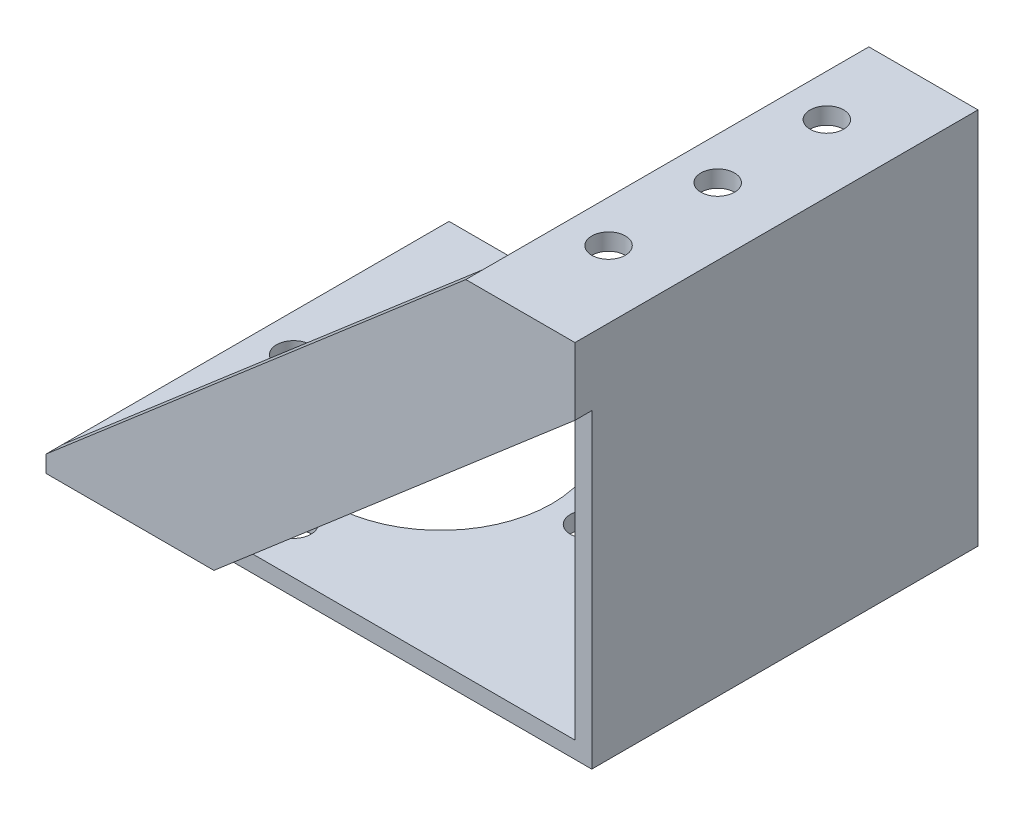
ISO-10303-21;
HEADER;
FILE_DESCRIPTION(('STEP AP214'),'2;1');
FILE_NAME('part.step','',(''),(''),'','','');
FILE_SCHEMA(('AUTOMOTIVE_DESIGN { 1 0 10303 214 1 1 1 1 }'));
ENDSEC;
DATA;
#1=APPLICATION_CONTEXT('core data for automotive mechanical design processes');
#2=APPLICATION_PROTOCOL_DEFINITION('international standard','automotive_design',2000,#1);
#3=PRODUCT_CONTEXT('',#1,'mechanical');
#4=PRODUCT('Part','Part','',(#3));
#5=PRODUCT_RELATED_PRODUCT_CATEGORY('part','',(#4));
#6=PRODUCT_DEFINITION_FORMATION('','',#4);
#7=PRODUCT_DEFINITION_CONTEXT('part definition',#1,'design');
#8=PRODUCT_DEFINITION('design','',#6,#7);
#9=PRODUCT_DEFINITION_SHAPE('','',#8);
#10=(LENGTH_UNIT() NAMED_UNIT(*) SI_UNIT(.MILLI.,.METRE.));
#11=(NAMED_UNIT(*) PLANE_ANGLE_UNIT() SI_UNIT($,.RADIAN.));
#12=(NAMED_UNIT(*) SI_UNIT($,.STERADIAN.) SOLID_ANGLE_UNIT());
#13=UNCERTAINTY_MEASURE_WITH_UNIT(LENGTH_MEASURE(1.E-05),#10,'distance_accuracy_value','');
#14=(GEOMETRIC_REPRESENTATION_CONTEXT(3) GLOBAL_UNCERTAINTY_ASSIGNED_CONTEXT((#13)) GLOBAL_UNIT_ASSIGNED_CONTEXT((#10,
#11,#12)) REPRESENTATION_CONTEXT('',''));
#15=CARTESIAN_POINT('',(0.,0.,0.));
#16=DIRECTION('',(0.,0.,1.));
#17=DIRECTION('',(1.,0.,0.));
#18=AXIS2_PLACEMENT_3D('',#15,#16,#17);
#19=CARTESIAN_POINT('',(-63.,0.,46.));
#20=DIRECTION('',(0.,1.,0.));
#21=DIRECTION('',(0.,0.,1.));
#22=AXIS2_PLACEMENT_3D('',#19,#20,#21);
#23=PLANE('',#22);
#24=CARTESIAN_POINT('',(-8.,0.,10.));
#25=DIRECTION('',(0.,1.,0.));
#26=DIRECTION('',(0.,0.,1.));
#27=AXIS2_PLACEMENT_3D('',#24,#25,#26);
#28=CIRCLE('',#27,2.);
#29=CARTESIAN_POINT('',(-8.,0.,12.));
#30=VERTEX_POINT('',#29);
#31=EDGE_CURVE('E201',#30,#30,#28,.T.);
#32=ORIENTED_EDGE('',*,*,#31,.T.);
#33=EDGE_LOOP('',(#32));
#34=FACE_BOUND('',#33,.T.);
#35=CARTESIAN_POINT('',(-8.,0.,23.));
#36=DIRECTION('',(0.,1.,0.));
#37=DIRECTION('',(0.,0.,1.));
#38=AXIS2_PLACEMENT_3D('',#35,#36,#37);
#39=CIRCLE('',#38,2.);
#40=CARTESIAN_POINT('',(-8.,0.,25.));
#41=VERTEX_POINT('',#40);
#42=EDGE_CURVE('E195',#41,#41,#39,.T.);
#43=ORIENTED_EDGE('',*,*,#42,.T.);
#44=EDGE_LOOP('',(#43));
#45=FACE_BOUND('',#44,.T.);
#46=CARTESIAN_POINT('',(-8.,0.,36.));
#47=DIRECTION('',(0.,1.,0.));
#48=DIRECTION('',(0.,0.,1.));
#49=AXIS2_PLACEMENT_3D('',#46,#47,#48);
#50=CIRCLE('',#49,2.);
#51=CARTESIAN_POINT('',(-8.,0.,38.));
#52=VERTEX_POINT('',#51);
#53=EDGE_CURVE('E188',#52,#52,#50,.T.);
#54=ORIENTED_EDGE('',*,*,#53,.T.);
#55=EDGE_LOOP('',(#54));
#56=FACE_BOUND('',#55,.T.);
#57=CARTESIAN_POINT('',(-41.,0.,40.5));
#58=DIRECTION('',(0.,-1.,0.));
#59=DIRECTION('',(0.,0.,-1.));
#60=AXIS2_PLACEMENT_3D('',#57,#58,#59);
#61=CIRCLE('',#60,2.04999999999999);
#62=CARTESIAN_POINT('',(-41.,0.,38.45));
#63=VERTEX_POINT('',#62);
#64=EDGE_CURVE('E221',#63,#63,#61,.T.);
#65=ORIENTED_EDGE('',*,*,#64,.F.);
#66=EDGE_LOOP('',(#65));
#67=FACE_BOUND('',#66,.T.);
#68=CARTESIAN_POINT('',(-58.5,0.,23.));
#69=DIRECTION('',(0.,-1.,0.));
#70=DIRECTION('',(0.,0.,-1.));
#71=AXIS2_PLACEMENT_3D('',#68,#69,#70);
#72=CIRCLE('',#71,2.04999999999999);
#73=CARTESIAN_POINT('',(-58.5,0.,20.95));
#74=VERTEX_POINT('',#73);
#75=EDGE_CURVE('E208',#74,#74,#72,.T.);
#76=ORIENTED_EDGE('',*,*,#75,.F.);
#77=EDGE_LOOP('',(#76));
#78=FACE_BOUND('',#77,.T.);
#79=CARTESIAN_POINT('',(-23.5,0.,23.));
#80=DIRECTION('',(0.,-1.,0.));
#81=DIRECTION('',(0.,0.,-1.));
#82=AXIS2_PLACEMENT_3D('',#79,#80,#81);
#83=CIRCLE('',#82,2.05);
#84=CARTESIAN_POINT('',(-23.5,0.,20.95));
#85=VERTEX_POINT('',#84);
#86=EDGE_CURVE('E209',#85,#85,#83,.T.);
#87=ORIENTED_EDGE('',*,*,#86,.F.);
#88=EDGE_LOOP('',(#87));
#89=FACE_BOUND('',#88,.T.);
#90=CARTESIAN_POINT('',(-41.,0.,5.5));
#91=DIRECTION('',(0.,-1.,0.));
#92=DIRECTION('',(0.,0.,-1.));
#93=AXIS2_PLACEMENT_3D('',#90,#91,#92);
#94=CIRCLE('',#93,2.04999999999999);
#95=CARTESIAN_POINT('',(-41.,0.,3.45));
#96=VERTEX_POINT('',#95);
#97=EDGE_CURVE('E204',#96,#96,#94,.T.);
#98=ORIENTED_EDGE('',*,*,#97,.F.);
#99=EDGE_LOOP('',(#98));
#100=FACE_BOUND('',#99,.T.);
#101=CARTESIAN_POINT('',(-41.,0.,23.));
#102=DIRECTION('',(0.,-1.,0.));
#103=DIRECTION('',(0.,0.,-1.));
#104=AXIS2_PLACEMENT_3D('',#101,#102,#103);
#105=CIRCLE('',#104,13.25);
#106=CARTESIAN_POINT('',(-41.,0.,9.75));
#107=VERTEX_POINT('',#106);
#108=EDGE_CURVE('E220',#107,#107,#105,.T.);
#109=ORIENTED_EDGE('',*,*,#108,.F.);
#110=EDGE_LOOP('',(#109));
#111=FACE_BOUND('',#110,.T.);
#112=DIRECTION('',(1.,0.,0.));
#113=VECTOR('',#112,1.);
#114=CARTESIAN_POINT('',(-63.,0.,0.));
#115=LINE('',#114,#113);
#116=CARTESIAN_POINT('',(-63.,0.,0.));
#117=VERTEX_POINT('',#116);
#118=CARTESIAN_POINT('',(0.,0.,0.));
#119=VERTEX_POINT('',#118);
#120=EDGE_CURVE('E232',#117,#119,#115,.T.);
#121=ORIENTED_EDGE('',*,*,#120,.T.);
#122=DIRECTION('',(0.,0.,-1.));
#123=VECTOR('',#122,1.);
#124=CARTESIAN_POINT('',(0.,0.,46.));
#125=LINE('',#124,#123);
#126=CARTESIAN_POINT('',(0.,0.,46.));
#127=VERTEX_POINT('',#126);
#128=EDGE_CURVE('E47',#127,#119,#125,.T.);
#129=ORIENTED_EDGE('',*,*,#128,.F.);
#130=DIRECTION('',(1.,0.,0.));
#131=VECTOR('',#130,1.);
#132=CARTESIAN_POINT('',(-63.,0.,46.));
#133=LINE('',#132,#131);
#134=CARTESIAN_POINT('',(-43.,0.,46.));
#135=VERTEX_POINT('',#134);
#136=EDGE_CURVE('E235',#135,#127,#133,.T.);
#137=ORIENTED_EDGE('',*,*,#136,.F.);
#138=DIRECTION('',(0.,0.,-1.));
#139=VECTOR('',#138,1.);
#140=CARTESIAN_POINT('',(-43.,0.,48.));
#141=LINE('',#140,#139);
#142=CARTESIAN_POINT('',(-43.,0.,48.));
#143=VERTEX_POINT('',#142);
#144=EDGE_CURVE('E145',#143,#135,#141,.T.);
#145=ORIENTED_EDGE('',*,*,#144,.F.);
#146=DIRECTION('',(1.,0.,0.));
#147=VECTOR('',#146,1.);
#148=CARTESIAN_POINT('',(-43.,0.,48.));
#149=LINE('',#148,#147);
#150=CARTESIAN_POINT('',(-63.,0.,48.));
#151=VERTEX_POINT('',#150);
#152=EDGE_CURVE('E143',#151,#143,#149,.T.);
#153=ORIENTED_EDGE('',*,*,#152,.F.);
#154=DIRECTION('',(0.,0.,-1.));
#155=VECTOR('',#154,1.);
#156=CARTESIAN_POINT('',(-63.,0.,46.));
#157=LINE('',#156,#155);
#158=EDGE_CURVE('E127',#151,#117,#157,.T.);
#159=ORIENTED_EDGE('',*,*,#158,.T.);
#160=EDGE_LOOP('',(#121,#129,#137,#145,#153,#159));
#161=FACE_BOUND('',#160,.T.);
#162=ADVANCED_FACE('F39',(#34,#45,#56,#67,#78,#89,#100,#111,#161),#23,.F.);
#163=CARTESIAN_POINT('',(0.,0.,46.));
#164=DIRECTION('',(-1.,0.,0.));
#165=DIRECTION('',(0.,0.,1.));
#166=AXIS2_PLACEMENT_3D('',#163,#164,#165);
#167=PLANE('',#166);
#168=DIRECTION('',(0.,1.,0.));
#169=VECTOR('',#168,1.);
#170=CARTESIAN_POINT('',(0.,0.,0.));
#171=LINE('',#170,#169);
#172=CARTESIAN_POINT('',(0.,45.,0.));
#173=VERTEX_POINT('',#172);
#174=EDGE_CURVE('E252',#119,#173,#171,.T.);
#175=ORIENTED_EDGE('',*,*,#174,.T.);
#176=DIRECTION('',(0.,0.,-1.));
#177=VECTOR('',#176,1.);
#178=CARTESIAN_POINT('',(0.,45.,46.));
#179=LINE('',#178,#177);
#180=CARTESIAN_POINT('',(0.,45.,48.));
#181=VERTEX_POINT('',#180);
#182=EDGE_CURVE('E278',#181,#173,#179,.T.);
#183=ORIENTED_EDGE('',*,*,#182,.F.);
#184=DIRECTION('',(0.,1.,0.));
#185=VECTOR('',#184,1.);
#186=CARTESIAN_POINT('',(0.,45.,48.));
#187=LINE('',#186,#185);
#188=CARTESIAN_POINT('',(0.,36.98,48.));
#189=VERTEX_POINT('',#188);
#190=EDGE_CURVE('E160',#189,#181,#187,.T.);
#191=ORIENTED_EDGE('',*,*,#190,.F.);
#192=DIRECTION('',(0.,0.,-1.));
#193=VECTOR('',#192,1.);
#194=CARTESIAN_POINT('',(0.,36.98,48.));
#195=LINE('',#194,#193);
#196=CARTESIAN_POINT('',(0.,36.98,46.));
#197=VERTEX_POINT('',#196);
#198=EDGE_CURVE('E171',#189,#197,#195,.T.);
#199=ORIENTED_EDGE('',*,*,#198,.T.);
#200=DIRECTION('',(0.,1.,0.));
#201=VECTOR('',#200,1.);
#202=CARTESIAN_POINT('',(0.,0.,46.));
#203=LINE('',#202,#201);
#204=EDGE_CURVE('E237',#127,#197,#203,.T.);
#205=ORIENTED_EDGE('',*,*,#204,.F.);
#206=ORIENTED_EDGE('',*,*,#128,.T.);
#207=EDGE_LOOP('',(#175,#183,#191,#199,#205,#206));
#208=FACE_BOUND('',#207,.T.);
#209=ADVANCED_FACE('F301',(#208),#167,.F.);
#210=CARTESIAN_POINT('',(0.,45.,46.));
#211=DIRECTION('',(0.,-1.,0.));
#212=DIRECTION('',(0.,0.,-1.));
#213=AXIS2_PLACEMENT_3D('',#210,#211,#212);
#214=PLANE('',#213);
#215=CARTESIAN_POINT('',(-8.,45.,10.));
#216=DIRECTION('',(0.,1.,0.));
#217=DIRECTION('',(0.,0.,1.));
#218=AXIS2_PLACEMENT_3D('',#215,#216,#217);
#219=CIRCLE('',#218,2.);
#220=CARTESIAN_POINT('',(-8.,45.,12.));
#221=VERTEX_POINT('',#220);
#222=EDGE_CURVE('E176',#221,#221,#219,.T.);
#223=ORIENTED_EDGE('',*,*,#222,.F.);
#224=EDGE_LOOP('',(#223));
#225=FACE_BOUND('',#224,.T.);
#226=CARTESIAN_POINT('',(-8.,45.,23.));
#227=DIRECTION('',(0.,1.,0.));
#228=DIRECTION('',(0.,0.,1.));
#229=AXIS2_PLACEMENT_3D('',#226,#227,#228);
#230=CIRCLE('',#229,2.);
#231=CARTESIAN_POINT('',(-8.,45.,25.));
#232=VERTEX_POINT('',#231);
#233=EDGE_CURVE('E180',#232,#232,#230,.T.);
#234=ORIENTED_EDGE('',*,*,#233,.F.);
#235=EDGE_LOOP('',(#234));
#236=FACE_BOUND('',#235,.T.);
#237=CARTESIAN_POINT('',(-8.,45.,36.));
#238=DIRECTION('',(0.,1.,0.));
#239=DIRECTION('',(0.,0.,1.));
#240=AXIS2_PLACEMENT_3D('',#237,#238,#239);
#241=CIRCLE('',#240,2.);
#242=CARTESIAN_POINT('',(-8.,45.,38.));
#243=VERTEX_POINT('',#242);
#244=EDGE_CURVE('E175',#243,#243,#241,.T.);
#245=ORIENTED_EDGE('',*,*,#244,.F.);
#246=EDGE_LOOP('',(#245));
#247=FACE_BOUND('',#246,.T.);
#248=DIRECTION('',(-1.,0.,0.));
#249=VECTOR('',#248,1.);
#250=CARTESIAN_POINT('',(0.,45.,0.));
#251=LINE('',#250,#249);
#252=CARTESIAN_POINT('',(-13.,45.,0.));
#253=VERTEX_POINT('',#252);
#254=EDGE_CURVE('E254',#173,#253,#251,.T.);
#255=ORIENTED_EDGE('',*,*,#254,.T.);
#256=DIRECTION('',(0.,0.,-1.));
#257=VECTOR('',#256,1.);
#258=CARTESIAN_POINT('',(-13.,45.,46.));
#259=LINE('',#258,#257);
#260=CARTESIAN_POINT('',(-13.,45.,46.));
#261=VERTEX_POINT('',#260);
#262=EDGE_CURVE('E275',#261,#253,#259,.T.);
#263=ORIENTED_EDGE('',*,*,#262,.F.);
#264=DIRECTION('',(0.,0.,-1.));
#265=VECTOR('',#264,1.);
#266=CARTESIAN_POINT('',(-13.,45.,48.));
#267=LINE('',#266,#265);
#268=CARTESIAN_POINT('',(-13.,45.,48.));
#269=VERTEX_POINT('',#268);
#270=EDGE_CURVE('E168',#269,#261,#267,.T.);
#271=ORIENTED_EDGE('',*,*,#270,.F.);
#272=DIRECTION('',(-1.,0.,0.));
#273=VECTOR('',#272,1.);
#274=CARTESIAN_POINT('',(-13.,45.,48.));
#275=LINE('',#274,#273);
#276=EDGE_CURVE('E163',#181,#269,#275,.T.);
#277=ORIENTED_EDGE('',*,*,#276,.F.);
#278=ORIENTED_EDGE('',*,*,#182,.T.);
#279=EDGE_LOOP('',(#255,#263,#271,#277,#278));
#280=FACE_BOUND('',#279,.T.);
#281=ADVANCED_FACE('F354',(#225,#236,#247,#280),#214,.F.);
#282=CARTESIAN_POINT('',(-13.,45.,46.));
#283=DIRECTION('',(1.,0.,0.));
#284=DIRECTION('',(0.,0.,-1.));
#285=AXIS2_PLACEMENT_3D('',#282,#283,#284);
#286=PLANE('',#285);
#287=DIRECTION('',(0.,-1.,0.));
#288=VECTOR('',#287,1.);
#289=CARTESIAN_POINT('',(-13.,45.,0.));
#290=LINE('',#289,#288);
#291=CARTESIAN_POINT('',(-13.,43.,0.));
#292=VERTEX_POINT('',#291);
#293=EDGE_CURVE('E256',#253,#292,#290,.T.);
#294=ORIENTED_EDGE('',*,*,#293,.T.);
#295=DIRECTION('',(0.,0.,-1.));
#296=VECTOR('',#295,1.);
#297=CARTESIAN_POINT('',(-13.,43.,46.));
#298=LINE('',#297,#296);
#299=CARTESIAN_POINT('',(-13.,43.,46.));
#300=VERTEX_POINT('',#299);
#301=EDGE_CURVE('E272',#300,#292,#298,.T.);
#302=ORIENTED_EDGE('',*,*,#301,.F.);
#303=DIRECTION('',(0.,-1.,0.));
#304=VECTOR('',#303,1.);
#305=CARTESIAN_POINT('',(-13.,45.,46.));
#306=LINE('',#305,#304);
#307=EDGE_CURVE('E239',#261,#300,#306,.T.);
#308=ORIENTED_EDGE('',*,*,#307,.F.);
#309=ORIENTED_EDGE('',*,*,#262,.T.);
#310=EDGE_LOOP('',(#294,#302,#308,#309));
#311=FACE_BOUND('',#310,.T.);
#312=ADVANCED_FACE('F350',(#311),#286,.F.);
#313=CARTESIAN_POINT('',(-13.,43.,46.));
#314=DIRECTION('',(0.,1.,0.));
#315=DIRECTION('',(0.,0.,1.));
#316=AXIS2_PLACEMENT_3D('',#313,#314,#315);
#317=PLANE('',#316);
#318=CARTESIAN_POINT('',(-8.,43.,10.));
#319=DIRECTION('',(0.,1.,0.));
#320=DIRECTION('',(0.,0.,1.));
#321=AXIS2_PLACEMENT_3D('',#318,#319,#320);
#322=CIRCLE('',#321,2.);
#323=CARTESIAN_POINT('',(-8.,43.,12.));
#324=VERTEX_POINT('',#323);
#325=EDGE_CURVE('E198',#324,#324,#322,.T.);
#326=ORIENTED_EDGE('',*,*,#325,.T.);
#327=EDGE_LOOP('',(#326));
#328=FACE_BOUND('',#327,.T.);
#329=CARTESIAN_POINT('',(-8.,43.,23.));
#330=DIRECTION('',(0.,1.,0.));
#331=DIRECTION('',(0.,0.,1.));
#332=AXIS2_PLACEMENT_3D('',#329,#330,#331);
#333=CIRCLE('',#332,2.);
#334=CARTESIAN_POINT('',(-8.,43.,25.));
#335=VERTEX_POINT('',#334);
#336=EDGE_CURVE('E192',#335,#335,#333,.T.);
#337=ORIENTED_EDGE('',*,*,#336,.T.);
#338=EDGE_LOOP('',(#337));
#339=FACE_BOUND('',#338,.T.);
#340=CARTESIAN_POINT('',(-8.,43.,36.));
#341=DIRECTION('',(0.,1.,0.));
#342=DIRECTION('',(0.,0.,1.));
#343=AXIS2_PLACEMENT_3D('',#340,#341,#342);
#344=CIRCLE('',#343,2.);
#345=CARTESIAN_POINT('',(-8.,43.,38.));
#346=VERTEX_POINT('',#345);
#347=EDGE_CURVE('E185',#346,#346,#344,.T.);
#348=ORIENTED_EDGE('',*,*,#347,.T.);
#349=EDGE_LOOP('',(#348));
#350=FACE_BOUND('',#349,.T.);
#351=DIRECTION('',(1.,0.,0.));
#352=VECTOR('',#351,1.);
#353=CARTESIAN_POINT('',(-13.,43.,0.));
#354=LINE('',#353,#352);
#355=CARTESIAN_POINT('',(-2.,43.,0.));
#356=VERTEX_POINT('',#355);
#357=EDGE_CURVE('E258',#292,#356,#354,.T.);
#358=ORIENTED_EDGE('',*,*,#357,.T.);
#359=DIRECTION('',(0.,0.,-1.));
#360=VECTOR('',#359,1.);
#361=CARTESIAN_POINT('',(-2.,43.,46.));
#362=LINE('',#361,#360);
#363=CARTESIAN_POINT('',(-2.,43.,46.));
#364=VERTEX_POINT('',#363);
#365=EDGE_CURVE('E269',#364,#356,#362,.T.);
#366=ORIENTED_EDGE('',*,*,#365,.F.);
#367=DIRECTION('',(1.,0.,0.));
#368=VECTOR('',#367,1.);
#369=CARTESIAN_POINT('',(-13.,43.,46.));
#370=LINE('',#369,#368);
#371=EDGE_CURVE('E242',#300,#364,#370,.T.);
#372=ORIENTED_EDGE('',*,*,#371,.F.);
#373=ORIENTED_EDGE('',*,*,#301,.T.);
#374=EDGE_LOOP('',(#358,#366,#372,#373));
#375=FACE_BOUND('',#374,.T.);
#376=ADVANCED_FACE('F346',(#328,#339,#350,#375),#317,.F.);
#377=CARTESIAN_POINT('',(-2.,43.,46.));
#378=DIRECTION('',(1.,0.,0.));
#379=DIRECTION('',(0.,1.,0.));
#380=AXIS2_PLACEMENT_3D('',#377,#378,#379);
#381=PLANE('',#380);
#382=DIRECTION('',(0.,-1.,0.));
#383=VECTOR('',#382,1.);
#384=CARTESIAN_POINT('',(-2.,43.,0.));
#385=LINE('',#384,#383);
#386=CARTESIAN_POINT('',(-1.99999999999999,2.00000000000001,0.));
#387=VERTEX_POINT('',#386);
#388=EDGE_CURVE('E260',#356,#387,#385,.T.);
#389=ORIENTED_EDGE('',*,*,#388,.T.);
#390=DIRECTION('',(0.,0.,-1.));
#391=VECTOR('',#390,1.);
#392=CARTESIAN_POINT('',(-1.99999999999999,2.00000000000001,46.));
#393=LINE('',#392,#391);
#394=CARTESIAN_POINT('',(-1.99999999999999,2.00000000000001,46.));
#395=VERTEX_POINT('',#394);
#396=EDGE_CURVE('E266',#395,#387,#393,.T.);
#397=ORIENTED_EDGE('',*,*,#396,.F.);
#398=DIRECTION('',(0.,-1.,0.));
#399=VECTOR('',#398,1.);
#400=CARTESIAN_POINT('',(-2.,43.,46.));
#401=LINE('',#400,#399);
#402=CARTESIAN_POINT('',(-2.,35.26,46.));
#403=VERTEX_POINT('',#402);
#404=EDGE_CURVE('E245',#403,#395,#401,.T.);
#405=ORIENTED_EDGE('',*,*,#404,.F.);
#406=EDGE_CURVE('E246',#364,#403,#401,.T.);
#407=ORIENTED_EDGE('',*,*,#406,.F.);
#408=ORIENTED_EDGE('',*,*,#365,.T.);
#409=EDGE_LOOP('',(#389,#397,#405,#407,#408));
#410=FACE_BOUND('',#409,.T.);
#411=ADVANCED_FACE('F342',(#410),#381,.F.);
#412=CARTESIAN_POINT('',(-1.99999999999999,2.00000000000001,46.));
#413=DIRECTION('',(0.,-1.,0.));
#414=DIRECTION('',(1.,0.,0.));
#415=AXIS2_PLACEMENT_3D('',#412,#413,#414);
#416=PLANE('',#415);
#417=CARTESIAN_POINT('',(-8.,2.00000000000001,10.));
#418=DIRECTION('',(0.,-1.,0.));
#419=DIRECTION('',(1.,0.,0.));
#420=AXIS2_PLACEMENT_3D('',#417,#418,#419);
#421=CIRCLE('',#420,2.);
#422=CARTESIAN_POINT('',(-6.,2.00000000000001,10.));
#423=VERTEX_POINT('',#422);
#424=EDGE_CURVE('E42',#423,#423,#421,.T.);
#425=ORIENTED_EDGE('',*,*,#424,.T.);
#426=EDGE_LOOP('',(#425));
#427=FACE_BOUND('',#426,.T.);
#428=CARTESIAN_POINT('',(-8.,2.00000000000001,23.));
#429=DIRECTION('',(0.,-1.,0.));
#430=DIRECTION('',(1.,0.,0.));
#431=AXIS2_PLACEMENT_3D('',#428,#429,#430);
#432=CIRCLE('',#431,2.);
#433=CARTESIAN_POINT('',(-6.,2.00000000000001,23.));
#434=VERTEX_POINT('',#433);
#435=EDGE_CURVE('E191',#434,#434,#432,.T.);
#436=ORIENTED_EDGE('',*,*,#435,.T.);
#437=EDGE_LOOP('',(#436));
#438=FACE_BOUND('',#437,.T.);
#439=CARTESIAN_POINT('',(-8.,2.00000000000001,36.));
#440=DIRECTION('',(0.,-1.,0.));
#441=DIRECTION('',(1.,0.,0.));
#442=AXIS2_PLACEMENT_3D('',#439,#440,#441);
#443=CIRCLE('',#442,2.);
#444=CARTESIAN_POINT('',(-5.99999999999999,2.00000000000001,36.));
#445=VERTEX_POINT('',#444);
#446=EDGE_CURVE('E179',#445,#445,#443,.T.);
#447=ORIENTED_EDGE('',*,*,#446,.T.);
#448=EDGE_LOOP('',(#447));
#449=FACE_BOUND('',#448,.T.);
#450=CARTESIAN_POINT('',(-41.,2.,40.5));
#451=DIRECTION('',(0.,-1.,0.));
#452=DIRECTION('',(0.,0.,-1.));
#453=AXIS2_PLACEMENT_3D('',#450,#451,#452);
#454=CIRCLE('',#453,2.04999999999999);
#455=CARTESIAN_POINT('',(-41.,2.,38.45));
#456=VERTEX_POINT('',#455);
#457=EDGE_CURVE('E217',#456,#456,#454,.T.);
#458=ORIENTED_EDGE('',*,*,#457,.T.);
#459=EDGE_LOOP('',(#458));
#460=FACE_BOUND('',#459,.T.);
#461=CARTESIAN_POINT('',(-58.5,2.,23.));
#462=DIRECTION('',(0.,-1.,0.));
#463=DIRECTION('',(0.,0.,-1.));
#464=AXIS2_PLACEMENT_3D('',#461,#462,#463);
#465=CIRCLE('',#464,2.04999999999999);
#466=CARTESIAN_POINT('',(-58.5,2.,20.95));
#467=VERTEX_POINT('',#466);
#468=EDGE_CURVE('E224',#467,#467,#465,.T.);
#469=ORIENTED_EDGE('',*,*,#468,.T.);
#470=EDGE_LOOP('',(#469));
#471=FACE_BOUND('',#470,.T.);
#472=CARTESIAN_POINT('',(-23.5,2.,23.));
#473=DIRECTION('',(0.,-1.,0.));
#474=DIRECTION('',(0.,0.,-1.));
#475=AXIS2_PLACEMENT_3D('',#472,#473,#474);
#476=CIRCLE('',#475,2.05);
#477=CARTESIAN_POINT('',(-23.5,2.,20.95));
#478=VERTEX_POINT('',#477);
#479=EDGE_CURVE('E205',#478,#478,#476,.T.);
#480=ORIENTED_EDGE('',*,*,#479,.T.);
#481=EDGE_LOOP('',(#480));
#482=FACE_BOUND('',#481,.T.);
#483=CARTESIAN_POINT('',(-41.,2.,5.5));
#484=DIRECTION('',(0.,-1.,0.));
#485=DIRECTION('',(0.,0.,-1.));
#486=AXIS2_PLACEMENT_3D('',#483,#484,#485);
#487=CIRCLE('',#486,2.04999999999999);
#488=CARTESIAN_POINT('',(-41.,2.,3.45));
#489=VERTEX_POINT('',#488);
#490=EDGE_CURVE('E212',#489,#489,#487,.T.);
#491=ORIENTED_EDGE('',*,*,#490,.T.);
#492=EDGE_LOOP('',(#491));
#493=FACE_BOUND('',#492,.T.);
#494=CARTESIAN_POINT('',(-41.,2.,23.));
#495=DIRECTION('',(0.,-1.,0.));
#496=DIRECTION('',(0.,0.,-1.));
#497=AXIS2_PLACEMENT_3D('',#494,#495,#496);
#498=CIRCLE('',#497,13.25);
#499=CARTESIAN_POINT('',(-41.,2.,9.75));
#500=VERTEX_POINT('',#499);
#501=EDGE_CURVE('E229',#500,#500,#498,.T.);
#502=ORIENTED_EDGE('',*,*,#501,.T.);
#503=EDGE_LOOP('',(#502));
#504=FACE_BOUND('',#503,.T.);
#505=DIRECTION('',(-1.,0.,0.));
#506=VECTOR('',#505,1.);
#507=CARTESIAN_POINT('',(-1.99999999999999,2.00000000000001,0.));
#508=LINE('',#507,#506);
#509=CARTESIAN_POINT('',(-63.,2.,0.));
#510=VERTEX_POINT('',#509);
#511=EDGE_CURVE('E262',#387,#510,#508,.T.);
#512=ORIENTED_EDGE('',*,*,#511,.T.);
#513=DIRECTION('',(0.,0.,-1.));
#514=VECTOR('',#513,1.);
#515=CARTESIAN_POINT('',(-63.,2.,46.));
#516=LINE('',#515,#514);
#517=CARTESIAN_POINT('',(-63.,2.,46.));
#518=VERTEX_POINT('',#517);
#519=EDGE_CURVE('E139',#518,#510,#516,.T.);
#520=ORIENTED_EDGE('',*,*,#519,.F.);
#521=DIRECTION('',(-1.,0.,0.));
#522=VECTOR('',#521,1.);
#523=CARTESIAN_POINT('',(-1.99999999999999,2.00000000000001,46.));
#524=LINE('',#523,#522);
#525=CARTESIAN_POINT('',(-40.6744186046512,1.99999999999999,46.));
#526=VERTEX_POINT('',#525);
#527=EDGE_CURVE('E249',#526,#518,#524,.T.);
#528=ORIENTED_EDGE('',*,*,#527,.F.);
#529=EDGE_CURVE('E140',#395,#526,#524,.T.);
#530=ORIENTED_EDGE('',*,*,#529,.F.);
#531=ORIENTED_EDGE('',*,*,#396,.T.);
#532=EDGE_LOOP('',(#512,#520,#528,#530,#531));
#533=FACE_BOUND('',#532,.T.);
#534=ADVANCED_FACE('F287',(#427,#438,#449,#460,#471,#482,#493,#504,#533),#416,.F.);
#535=CARTESIAN_POINT('',(-63.,2.,46.));
#536=DIRECTION('',(1.,0.,0.));
#537=DIRECTION('',(0.,1.,0.));
#538=AXIS2_PLACEMENT_3D('',#535,#536,#537);
#539=PLANE('',#538);
#540=DIRECTION('',(0.,-1.,0.));
#541=VECTOR('',#540,1.);
#542=CARTESIAN_POINT('',(-63.,2.,0.));
#543=LINE('',#542,#541);
#544=EDGE_CURVE('E135',#510,#117,#543,.T.);
#545=ORIENTED_EDGE('',*,*,#544,.T.);
#546=ORIENTED_EDGE('',*,*,#158,.F.);
#547=DIRECTION('',(0.,-1.,0.));
#548=VECTOR('',#547,1.);
#549=CARTESIAN_POINT('',(-63.,0.,48.));
#550=LINE('',#549,#548);
#551=CARTESIAN_POINT('',(-63.,2.,48.));
#552=VERTEX_POINT('',#551);
#553=EDGE_CURVE('E132',#552,#151,#550,.T.);
#554=ORIENTED_EDGE('',*,*,#553,.F.);
#555=DIRECTION('',(0.,0.,-1.));
#556=VECTOR('',#555,1.);
#557=CARTESIAN_POINT('',(-63.,2.,48.));
#558=LINE('',#557,#556);
#559=EDGE_CURVE('E165',#552,#518,#558,.T.);
#560=ORIENTED_EDGE('',*,*,#559,.T.);
#561=ORIENTED_EDGE('',*,*,#519,.T.);
#562=EDGE_LOOP('',(#545,#546,#554,#560,#561));
#563=FACE_BOUND('',#562,.T.);
#564=ADVANCED_FACE('F129',(#563),#539,.F.);
#565=CARTESIAN_POINT('',(0.,0.,46.));
#566=DIRECTION('',(0.,0.,1.));
#567=DIRECTION('',(1.,0.,0.));
#568=AXIS2_PLACEMENT_3D('',#565,#566,#567);
#569=PLANE('',#568);
#570=DIRECTION('',(0.758185196311683,0.652039268828048,0.));
#571=VECTOR('',#570,1.);
#572=CARTESIAN_POINT('',(0.,36.98,46.));
#573=LINE('',#572,#571);
#574=EDGE_CURVE('E49',#135,#526,#573,.T.);
#575=ORIENTED_EDGE('',*,*,#574,.F.);
#576=ORIENTED_EDGE('',*,*,#136,.T.);
#577=ORIENTED_EDGE('',*,*,#204,.T.);
#578=EDGE_CURVE('E11',#403,#197,#573,.T.);
#579=ORIENTED_EDGE('',*,*,#578,.F.);
#580=ORIENTED_EDGE('',*,*,#404,.T.);
#581=ORIENTED_EDGE('',*,*,#529,.T.);
#582=EDGE_LOOP('',(#575,#576,#577,#579,#580,#581));
#583=FACE_BOUND('',#582,.T.);
#584=ADVANCED_FACE('F328',(#583),#569,.T.);
#585=CARTESIAN_POINT('',(0.,0.,0.));
#586=DIRECTION('',(0.,0.,1.));
#587=DIRECTION('',(1.,0.,0.));
#588=AXIS2_PLACEMENT_3D('',#585,#586,#587);
#589=PLANE('',#588);
#590=ORIENTED_EDGE('',*,*,#120,.F.);
#591=ORIENTED_EDGE('',*,*,#544,.F.);
#592=ORIENTED_EDGE('',*,*,#511,.F.);
#593=ORIENTED_EDGE('',*,*,#388,.F.);
#594=ORIENTED_EDGE('',*,*,#357,.F.);
#595=ORIENTED_EDGE('',*,*,#293,.F.);
#596=ORIENTED_EDGE('',*,*,#254,.F.);
#597=ORIENTED_EDGE('',*,*,#174,.F.);
#598=EDGE_LOOP('',(#590,#591,#592,#593,#594,#595,#596,#597));
#599=FACE_BOUND('',#598,.T.);
#600=ADVANCED_FACE('F318',(#599),#589,.F.);
#601=CARTESIAN_POINT('',(-41.,2.,23.));
#602=DIRECTION('',(0.,-1.,0.));
#603=DIRECTION('',(0.,0.,-1.));
#604=AXIS2_PLACEMENT_3D('',#601,#602,#603);
#605=CYLINDRICAL_SURFACE('',#604,13.25);
#606=ORIENTED_EDGE('',*,*,#501,.F.);
#607=EDGE_LOOP('',(#606));
#608=FACE_BOUND('',#607,.T.);
#609=ORIENTED_EDGE('',*,*,#108,.T.);
#610=EDGE_LOOP('',(#609));
#611=FACE_BOUND('',#610,.T.);
#612=ADVANCED_FACE('F315',(#608,#611),#605,.F.);
#613=CARTESIAN_POINT('',(-41.,2.,5.5));
#614=DIRECTION('',(0.,-1.,0.));
#615=DIRECTION('',(0.,0.,-1.));
#616=AXIS2_PLACEMENT_3D('',#613,#614,#615);
#617=CYLINDRICAL_SURFACE('',#616,2.04999999999999);
#618=ORIENTED_EDGE('',*,*,#490,.F.);
#619=EDGE_LOOP('',(#618));
#620=FACE_BOUND('',#619,.T.);
#621=ORIENTED_EDGE('',*,*,#97,.T.);
#622=EDGE_LOOP('',(#621));
#623=FACE_BOUND('',#622,.T.);
#624=ADVANCED_FACE('F317',(#620,#623),#617,.F.);
#625=CARTESIAN_POINT('',(-23.5,2.,23.));
#626=DIRECTION('',(0.,-1.,0.));
#627=DIRECTION('',(0.,0.,-1.));
#628=AXIS2_PLACEMENT_3D('',#625,#626,#627);
#629=CYLINDRICAL_SURFACE('',#628,2.05);
#630=ORIENTED_EDGE('',*,*,#479,.F.);
#631=EDGE_LOOP('',(#630));
#632=FACE_BOUND('',#631,.T.);
#633=ORIENTED_EDGE('',*,*,#86,.T.);
#634=EDGE_LOOP('',(#633));
#635=FACE_BOUND('',#634,.T.);
#636=ADVANCED_FACE('F325',(#632,#635),#629,.F.);
#637=CARTESIAN_POINT('',(-58.5,2.,23.));
#638=DIRECTION('',(0.,-1.,0.));
#639=DIRECTION('',(0.,0.,-1.));
#640=AXIS2_PLACEMENT_3D('',#637,#638,#639);
#641=CYLINDRICAL_SURFACE('',#640,2.04999999999999);
#642=ORIENTED_EDGE('',*,*,#468,.F.);
#643=EDGE_LOOP('',(#642));
#644=FACE_BOUND('',#643,.T.);
#645=ORIENTED_EDGE('',*,*,#75,.T.);
#646=EDGE_LOOP('',(#645));
#647=FACE_BOUND('',#646,.T.);
#648=ADVANCED_FACE('F334',(#644,#647),#641,.F.);
#649=CARTESIAN_POINT('',(-41.,2.,40.5));
#650=DIRECTION('',(0.,-1.,0.));
#651=DIRECTION('',(0.,0.,-1.));
#652=AXIS2_PLACEMENT_3D('',#649,#650,#651);
#653=CYLINDRICAL_SURFACE('',#652,2.04999999999999);
#654=ORIENTED_EDGE('',*,*,#457,.F.);
#655=EDGE_LOOP('',(#654));
#656=FACE_BOUND('',#655,.T.);
#657=ORIENTED_EDGE('',*,*,#64,.T.);
#658=EDGE_LOOP('',(#657));
#659=FACE_BOUND('',#658,.T.);
#660=ADVANCED_FACE('F409',(#656,#659),#653,.F.);
#661=CARTESIAN_POINT('',(-8.,-55.,36.));
#662=DIRECTION('',(0.,1.,0.));
#663=DIRECTION('',(0.,0.,1.));
#664=AXIS2_PLACEMENT_3D('',#661,#662,#663);
#665=CYLINDRICAL_SURFACE('',#664,2.);
#666=ORIENTED_EDGE('',*,*,#446,.F.);
#667=EDGE_LOOP('',(#666));
#668=FACE_BOUND('',#667,.T.);
#669=ORIENTED_EDGE('',*,*,#53,.F.);
#670=EDGE_LOOP('',(#669));
#671=FACE_BOUND('',#670,.T.);
#672=ADVANCED_FACE('F294',(#668,#671),#665,.F.);
#673=CARTESIAN_POINT('',(-8.,-55.,23.));
#674=DIRECTION('',(0.,1.,0.));
#675=DIRECTION('',(0.,0.,1.));
#676=AXIS2_PLACEMENT_3D('',#673,#674,#675);
#677=CYLINDRICAL_SURFACE('',#676,2.);
#678=ORIENTED_EDGE('',*,*,#435,.F.);
#679=EDGE_LOOP('',(#678));
#680=FACE_BOUND('',#679,.T.);
#681=ORIENTED_EDGE('',*,*,#42,.F.);
#682=EDGE_LOOP('',(#681));
#683=FACE_BOUND('',#682,.T.);
#684=ADVANCED_FACE('F290',(#680,#683),#677,.F.);
#685=CARTESIAN_POINT('',(-8.,-55.,10.));
#686=DIRECTION('',(0.,1.,0.));
#687=DIRECTION('',(0.,0.,1.));
#688=AXIS2_PLACEMENT_3D('',#685,#686,#687);
#689=CYLINDRICAL_SURFACE('',#688,2.);
#690=ORIENTED_EDGE('',*,*,#424,.F.);
#691=EDGE_LOOP('',(#690));
#692=FACE_BOUND('',#691,.T.);
#693=ORIENTED_EDGE('',*,*,#31,.F.);
#694=EDGE_LOOP('',(#693));
#695=FACE_BOUND('',#694,.T.);
#696=ADVANCED_FACE('F293',(#692,#695),#689,.F.);
#697=ORIENTED_EDGE('',*,*,#244,.T.);
#698=EDGE_LOOP('',(#697));
#699=FACE_BOUND('',#698,.T.);
#700=ORIENTED_EDGE('',*,*,#347,.F.);
#701=EDGE_LOOP('',(#700));
#702=FACE_BOUND('',#701,.T.);
#703=ADVANCED_FACE('F404',(#699,#702),#665,.F.);
#704=ORIENTED_EDGE('',*,*,#233,.T.);
#705=EDGE_LOOP('',(#704));
#706=FACE_BOUND('',#705,.T.);
#707=ORIENTED_EDGE('',*,*,#336,.F.);
#708=EDGE_LOOP('',(#707));
#709=FACE_BOUND('',#708,.T.);
#710=ADVANCED_FACE('F296',(#706,#709),#677,.F.);
#711=ORIENTED_EDGE('',*,*,#222,.T.);
#712=EDGE_LOOP('',(#711));
#713=FACE_BOUND('',#712,.T.);
#714=ORIENTED_EDGE('',*,*,#325,.F.);
#715=EDGE_LOOP('',(#714));
#716=FACE_BOUND('',#715,.T.);
#717=ADVANCED_FACE('F393',(#713,#716),#689,.F.);
#718=CARTESIAN_POINT('',(0.,36.98,48.));
#719=DIRECTION('',(-0.652039268828048,0.758185196311683,0.));
#720=DIRECTION('',(-0.758185196311683,-0.652039268828048,0.));
#721=AXIS2_PLACEMENT_3D('',#718,#719,#720);
#722=PLANE('',#721);
#723=ORIENTED_EDGE('',*,*,#574,.T.);
#724=EDGE_CURVE('E50',#526,#403,#573,.T.);
#725=ORIENTED_EDGE('',*,*,#724,.T.);
#726=ORIENTED_EDGE('',*,*,#578,.T.);
#727=ORIENTED_EDGE('',*,*,#198,.F.);
#728=DIRECTION('',(0.758185196311683,0.652039268828048,0.));
#729=VECTOR('',#728,1.);
#730=CARTESIAN_POINT('',(0.,36.98,48.));
#731=LINE('',#730,#729);
#732=EDGE_CURVE('E148',#143,#189,#731,.T.);
#733=ORIENTED_EDGE('',*,*,#732,.F.);
#734=ORIENTED_EDGE('',*,*,#144,.T.);
#735=EDGE_LOOP('',(#723,#725,#726,#727,#733,#734));
#736=FACE_BOUND('',#735,.T.);
#737=ADVANCED_FACE('F386',(#736),#722,.F.);
#738=CARTESIAN_POINT('',(-63.,2.,48.));
#739=DIRECTION('',(0.652039268828047,-0.758185196311683,0.));
#740=DIRECTION('',(0.758185196311683,0.652039268828047,0.));
#741=AXIS2_PLACEMENT_3D('',#738,#739,#740);
#742=PLANE('',#741);
#743=DIRECTION('',(-0.758185196311683,-0.652039268828047,0.));
#744=VECTOR('',#743,1.);
#745=CARTESIAN_POINT('',(-63.,2.,46.));
#746=LINE('',#745,#744);
#747=EDGE_CURVE('E154',#261,#518,#746,.T.);
#748=ORIENTED_EDGE('',*,*,#747,.T.);
#749=ORIENTED_EDGE('',*,*,#559,.F.);
#750=DIRECTION('',(-0.758185196311683,-0.652039268828047,0.));
#751=VECTOR('',#750,1.);
#752=CARTESIAN_POINT('',(-63.,2.,48.));
#753=LINE('',#752,#751);
#754=EDGE_CURVE('E152',#269,#552,#753,.T.);
#755=ORIENTED_EDGE('',*,*,#754,.F.);
#756=ORIENTED_EDGE('',*,*,#270,.T.);
#757=EDGE_LOOP('',(#748,#749,#755,#756));
#758=FACE_BOUND('',#757,.T.);
#759=ADVANCED_FACE('F381',(#758),#742,.F.);
#760=CARTESIAN_POINT('',(0.,0.,48.));
#761=DIRECTION('',(0.,0.,-1.));
#762=DIRECTION('',(-1.,0.,0.));
#763=AXIS2_PLACEMENT_3D('',#760,#761,#762);
#764=PLANE('',#763);
#765=ORIENTED_EDGE('',*,*,#553,.T.);
#766=ORIENTED_EDGE('',*,*,#152,.T.);
#767=ORIENTED_EDGE('',*,*,#732,.T.);
#768=ORIENTED_EDGE('',*,*,#190,.T.);
#769=ORIENTED_EDGE('',*,*,#276,.T.);
#770=ORIENTED_EDGE('',*,*,#754,.T.);
#771=EDGE_LOOP('',(#765,#766,#767,#768,#769,#770));
#772=FACE_BOUND('',#771,.T.);
#773=ADVANCED_FACE('F150',(#772),#764,.F.);
#774=CARTESIAN_POINT('',(0.,0.,46.));
#775=DIRECTION('',(0.,0.,-1.));
#776=DIRECTION('',(-1.,0.,0.));
#777=AXIS2_PLACEMENT_3D('',#774,#775,#776);
#778=PLANE('',#777);
#779=ORIENTED_EDGE('',*,*,#747,.F.);
#780=ORIENTED_EDGE('',*,*,#307,.T.);
#781=ORIENTED_EDGE('',*,*,#371,.T.);
#782=ORIENTED_EDGE('',*,*,#406,.T.);
#783=ORIENTED_EDGE('',*,*,#724,.F.);
#784=ORIENTED_EDGE('',*,*,#527,.T.);
#785=EDGE_LOOP('',(#779,#780,#781,#782,#783,#784));
#786=FACE_BOUND('',#785,.T.);
#787=ADVANCED_FACE('F378',(#786),#778,.T.);
#788=CLOSED_SHELL('',(#162,#209,#281,#312,#376,#411,#534,#564,#584,#600,#612,#624,#636,#648,
#660,#672,#684,#696,#703,#710,#717,#737,#759,#773,#787));
#789=MANIFOLD_SOLID_BREP('B2',#788);
#790=ADVANCED_BREP_SHAPE_REPRESENTATION('',(#18,#789),#14);
#791=SHAPE_DEFINITION_REPRESENTATION(#9,#790);
ENDSEC;
END-ISO-10303-21;
